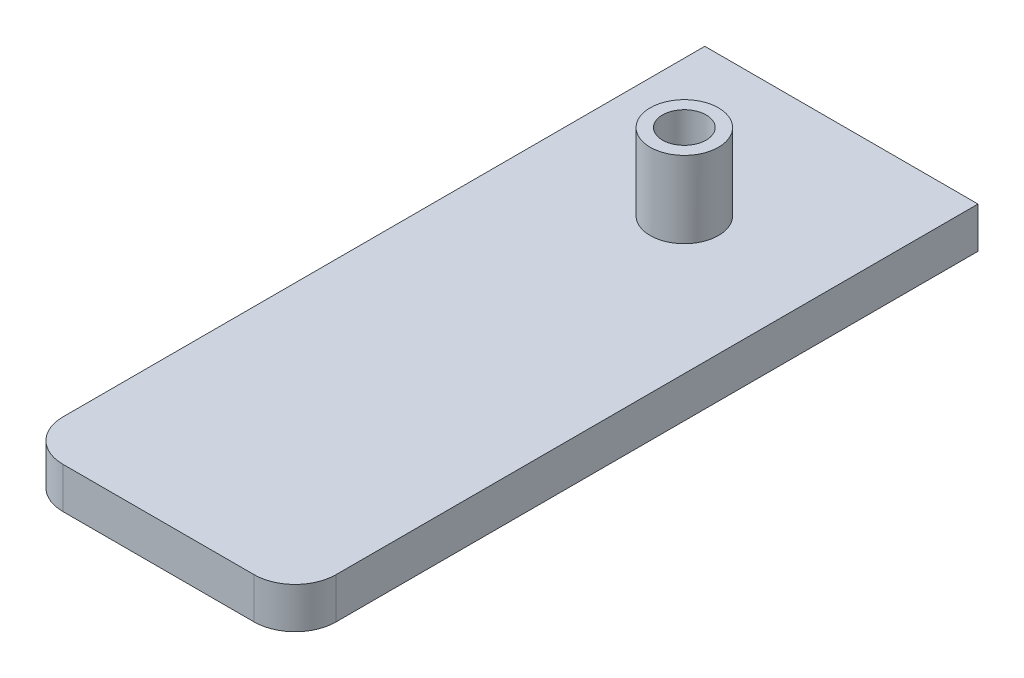
ISO-10303-21;
HEADER;
FILE_DESCRIPTION(('STEP AP214'),'2;1');
FILE_NAME('part.step','',(''),(''),'','','');
FILE_SCHEMA(('AUTOMOTIVE_DESIGN { 1 0 10303 214 1 1 1 1 }'));
ENDSEC;
DATA;
#1=APPLICATION_CONTEXT('core data for automotive mechanical design processes');
#2=APPLICATION_PROTOCOL_DEFINITION('international standard','automotive_design',2000,#1);
#3=PRODUCT_CONTEXT('',#1,'mechanical');
#4=PRODUCT('Part','Part','',(#3));
#5=PRODUCT_RELATED_PRODUCT_CATEGORY('part','',(#4));
#6=PRODUCT_DEFINITION_FORMATION('','',#4);
#7=PRODUCT_DEFINITION_CONTEXT('part definition',#1,'design');
#8=PRODUCT_DEFINITION('design','',#6,#7);
#9=PRODUCT_DEFINITION_SHAPE('','',#8);
#10=(LENGTH_UNIT() NAMED_UNIT(*) SI_UNIT(.MILLI.,.METRE.));
#11=(NAMED_UNIT(*) PLANE_ANGLE_UNIT() SI_UNIT($,.RADIAN.));
#12=(NAMED_UNIT(*) SI_UNIT($,.STERADIAN.) SOLID_ANGLE_UNIT());
#13=UNCERTAINTY_MEASURE_WITH_UNIT(LENGTH_MEASURE(1.E-05),#10,'distance_accuracy_value','');
#14=(GEOMETRIC_REPRESENTATION_CONTEXT(3) GLOBAL_UNCERTAINTY_ASSIGNED_CONTEXT((#13)) GLOBAL_UNIT_ASSIGNED_CONTEXT((#10,
#11,#12)) REPRESENTATION_CONTEXT('',''));
#15=CARTESIAN_POINT('',(0.,0.,0.));
#16=DIRECTION('',(0.,0.,1.));
#17=DIRECTION('',(1.,0.,0.));
#18=AXIS2_PLACEMENT_3D('',#15,#16,#17);
#19=CARTESIAN_POINT('',(0.,3.,0.));
#20=DIRECTION('',(0.,-1.,0.));
#21=DIRECTION('',(0.,0.,-1.));
#22=AXIS2_PLACEMENT_3D('',#19,#20,#21);
#23=PLANE('',#22);
#24=DIRECTION('',(0.,0.,1.));
#25=VECTOR('',#24,1.);
#26=CARTESIAN_POINT('',(-9.99999999999999,3.,25.));
#27=LINE('',#26,#25);
#28=CARTESIAN_POINT('',(-9.99999999999999,3.,-25.));
#29=VERTEX_POINT('',#28);
#30=CARTESIAN_POINT('',(-9.99999999999999,3.,22.));
#31=VERTEX_POINT('',#30);
#32=EDGE_CURVE('E117',#29,#31,#27,.T.);
#33=ORIENTED_EDGE('',*,*,#32,.T.);
#34=CARTESIAN_POINT('',(-6.99999999999999,3.,22.));
#35=DIRECTION('',(0.,-1.,0.));
#36=DIRECTION('',(0.,0.,-1.));
#37=AXIS2_PLACEMENT_3D('',#34,#35,#36);
#38=CIRCLE('',#37,3.);
#39=CARTESIAN_POINT('',(-7.,3.,25.));
#40=VERTEX_POINT('',#39);
#41=EDGE_CURVE('E54',#31,#40,#38,.F.);
#42=ORIENTED_EDGE('',*,*,#41,.T.);
#43=DIRECTION('',(1.,0.,0.));
#44=VECTOR('',#43,1.);
#45=CARTESIAN_POINT('',(-9.99999999999999,3.,25.));
#46=LINE('',#45,#44);
#47=CARTESIAN_POINT('',(7.00000000000001,3.,25.));
#48=VERTEX_POINT('',#47);
#49=EDGE_CURVE('E131',#40,#48,#46,.T.);
#50=ORIENTED_EDGE('',*,*,#49,.T.);
#51=CARTESIAN_POINT('',(7.00000000000001,3.,22.));
#52=DIRECTION('',(0.,-1.,0.));
#53=DIRECTION('',(0.,0.,-1.));
#54=AXIS2_PLACEMENT_3D('',#51,#52,#53);
#55=CIRCLE('',#54,3.);
#56=CARTESIAN_POINT('',(10.,3.,22.));
#57=VERTEX_POINT('',#56);
#58=EDGE_CURVE('E61',#48,#57,#55,.F.);
#59=ORIENTED_EDGE('',*,*,#58,.T.);
#60=DIRECTION('',(0.,0.,-1.));
#61=VECTOR('',#60,1.);
#62=CARTESIAN_POINT('',(10.,3.,25.));
#63=LINE('',#62,#61);
#64=CARTESIAN_POINT('',(10.,3.,-25.));
#65=VERTEX_POINT('',#64);
#66=EDGE_CURVE('E99',#57,#65,#63,.T.);
#67=ORIENTED_EDGE('',*,*,#66,.T.);
#68=DIRECTION('',(-1.,0.,0.));
#69=VECTOR('',#68,1.);
#70=CARTESIAN_POINT('',(-9.99999999999999,3.,-25.));
#71=LINE('',#70,#69);
#72=EDGE_CURVE('E102',#65,#29,#71,.T.);
#73=ORIENTED_EDGE('',*,*,#72,.T.);
#74=EDGE_LOOP('',(#33,#42,#50,#59,#67,#73));
#75=FACE_BOUND('',#74,.T.);
#76=CARTESIAN_POINT('',(6.04960526118248E-10,3.,-13.4999999995098));
#77=DIRECTION('',(0.,-1.,0.));
#78=DIRECTION('',(0.,0.,-1.));
#79=AXIS2_PLACEMENT_3D('',#76,#77,#78);
#80=CIRCLE('',#79,2.49999999950536);
#81=CARTESIAN_POINT('',(6.04960526118248E-10,3.,-15.9999999990152));
#82=VERTEX_POINT('',#81);
#83=EDGE_CURVE('E124',#82,#82,#80,.F.);
#84=ORIENTED_EDGE('',*,*,#83,.F.);
#85=EDGE_LOOP('',(#84));
#86=FACE_BOUND('',#85,.T.);
#87=ADVANCED_FACE('F45',(#75,#86),#23,.F.);
#88=CARTESIAN_POINT('',(10.,3.,25.));
#89=DIRECTION('',(-1.,0.,0.));
#90=DIRECTION('',(0.,0.,1.));
#91=AXIS2_PLACEMENT_3D('',#88,#89,#90);
#92=PLANE('',#91);
#93=ORIENTED_EDGE('',*,*,#66,.F.);
#94=DIRECTION('',(0.,-1.,0.));
#95=VECTOR('',#94,1.);
#96=CARTESIAN_POINT('',(10.,3.,22.));
#97=LINE('',#96,#95);
#98=CARTESIAN_POINT('',(10.,0.,22.));
#99=VERTEX_POINT('',#98);
#100=EDGE_CURVE('E11',#57,#99,#97,.T.);
#101=ORIENTED_EDGE('',*,*,#100,.T.);
#102=DIRECTION('',(0.,0.,-1.));
#103=VECTOR('',#102,1.);
#104=CARTESIAN_POINT('',(10.,0.,25.));
#105=LINE('',#104,#103);
#106=CARTESIAN_POINT('',(10.,0.,-25.));
#107=VERTEX_POINT('',#106);
#108=EDGE_CURVE('E121',#99,#107,#105,.T.);
#109=ORIENTED_EDGE('',*,*,#108,.T.);
#110=DIRECTION('',(0.,-1.,0.));
#111=VECTOR('',#110,1.);
#112=CARTESIAN_POINT('',(10.,3.,-25.));
#113=LINE('',#112,#111);
#114=EDGE_CURVE('E113',#65,#107,#113,.T.);
#115=ORIENTED_EDGE('',*,*,#114,.F.);
#116=EDGE_LOOP('',(#93,#101,#109,#115));
#117=FACE_BOUND('',#116,.T.);
#118=ADVANCED_FACE('F119',(#117),#92,.F.);
#119=CARTESIAN_POINT('',(-9.99999999999999,3.,-25.));
#120=DIRECTION('',(0.,0.,1.));
#121=DIRECTION('',(1.,0.,0.));
#122=AXIS2_PLACEMENT_3D('',#119,#120,#121);
#123=PLANE('',#122);
#124=DIRECTION('',(-1.,0.,0.));
#125=VECTOR('',#124,1.);
#126=CARTESIAN_POINT('',(-9.99999999999999,0.,-25.));
#127=LINE('',#126,#125);
#128=CARTESIAN_POINT('',(-9.99999999999999,0.,-25.));
#129=VERTEX_POINT('',#128);
#130=EDGE_CURVE('E169',#107,#129,#127,.T.);
#131=ORIENTED_EDGE('',*,*,#130,.T.);
#132=DIRECTION('',(0.,-1.,0.));
#133=VECTOR('',#132,1.);
#134=CARTESIAN_POINT('',(-9.99999999999999,3.,-25.));
#135=LINE('',#134,#133);
#136=EDGE_CURVE('E115',#29,#129,#135,.T.);
#137=ORIENTED_EDGE('',*,*,#136,.F.);
#138=ORIENTED_EDGE('',*,*,#72,.F.);
#139=ORIENTED_EDGE('',*,*,#114,.T.);
#140=EDGE_LOOP('',(#131,#137,#138,#139));
#141=FACE_BOUND('',#140,.T.);
#142=ADVANCED_FACE('F112',(#141),#123,.F.);
#143=CARTESIAN_POINT('',(-9.99999999999999,3.,25.));
#144=DIRECTION('',(1.,0.,0.));
#145=DIRECTION('',(0.,0.,-1.));
#146=AXIS2_PLACEMENT_3D('',#143,#144,#145);
#147=PLANE('',#146);
#148=DIRECTION('',(0.,0.,1.));
#149=VECTOR('',#148,1.);
#150=CARTESIAN_POINT('',(-9.99999999999999,0.,25.));
#151=LINE('',#150,#149);
#152=CARTESIAN_POINT('',(-9.99999999999999,0.,22.));
#153=VERTEX_POINT('',#152);
#154=EDGE_CURVE('E166',#129,#153,#151,.T.);
#155=ORIENTED_EDGE('',*,*,#154,.T.);
#156=DIRECTION('',(0.,-1.,0.));
#157=VECTOR('',#156,1.);
#158=CARTESIAN_POINT('',(-9.99999999999999,3.,22.));
#159=LINE('',#158,#157);
#160=EDGE_CURVE('E69',#153,#31,#159,.F.);
#161=ORIENTED_EDGE('',*,*,#160,.T.);
#162=ORIENTED_EDGE('',*,*,#32,.F.);
#163=ORIENTED_EDGE('',*,*,#136,.T.);
#164=EDGE_LOOP('',(#155,#161,#162,#163));
#165=FACE_BOUND('',#164,.T.);
#166=ADVANCED_FACE('F167',(#165),#147,.F.);
#167=CARTESIAN_POINT('',(-9.99999999999999,3.,25.));
#168=DIRECTION('',(0.,0.,-1.));
#169=DIRECTION('',(-1.,0.,0.));
#170=AXIS2_PLACEMENT_3D('',#167,#168,#169);
#171=PLANE('',#170);
#172=ORIENTED_EDGE('',*,*,#49,.F.);
#173=DIRECTION('',(0.,-1.,0.));
#174=VECTOR('',#173,1.);
#175=CARTESIAN_POINT('',(-7.,3.,25.));
#176=LINE('',#175,#174);
#177=CARTESIAN_POINT('',(-7.,0.,25.));
#178=VERTEX_POINT('',#177);
#179=EDGE_CURVE('E137',#40,#178,#176,.T.);
#180=ORIENTED_EDGE('',*,*,#179,.T.);
#181=DIRECTION('',(1.,0.,0.));
#182=VECTOR('',#181,1.);
#183=CARTESIAN_POINT('',(-9.99999999999999,0.,25.));
#184=LINE('',#183,#182);
#185=CARTESIAN_POINT('',(7.00000000000001,0.,25.));
#186=VERTEX_POINT('',#185);
#187=EDGE_CURVE('E108',#178,#186,#184,.T.);
#188=ORIENTED_EDGE('',*,*,#187,.T.);
#189=DIRECTION('',(0.,-1.,0.));
#190=VECTOR('',#189,1.);
#191=CARTESIAN_POINT('',(7.00000000000001,3.,25.));
#192=LINE('',#191,#190);
#193=EDGE_CURVE('E129',#186,#48,#192,.F.);
#194=ORIENTED_EDGE('',*,*,#193,.T.);
#195=EDGE_LOOP('',(#172,#180,#188,#194));
#196=FACE_BOUND('',#195,.T.);
#197=ADVANCED_FACE('F156',(#196),#171,.F.);
#198=CARTESIAN_POINT('',(0.,0.,0.));
#199=DIRECTION('',(0.,-1.,0.));
#200=DIRECTION('',(0.,0.,-1.));
#201=AXIS2_PLACEMENT_3D('',#198,#199,#200);
#202=PLANE('',#201);
#203=CARTESIAN_POINT('',(0.,0.,-13.5));
#204=DIRECTION('',(0.,-1.,0.));
#205=DIRECTION('',(0.,0.,-1.));
#206=AXIS2_PLACEMENT_3D('',#203,#204,#205);
#207=CIRCLE('',#206,1.6);
#208=CARTESIAN_POINT('',(0.,0.,-15.1));
#209=VERTEX_POINT('',#208);
#210=EDGE_CURVE('E176',#209,#209,#207,.T.);
#211=ORIENTED_EDGE('',*,*,#210,.F.);
#212=EDGE_LOOP('',(#211));
#213=FACE_BOUND('',#212,.T.);
#214=ORIENTED_EDGE('',*,*,#187,.F.);
#215=CARTESIAN_POINT('',(-6.99999999999999,0.,22.));
#216=DIRECTION('',(0.,-1.,0.));
#217=DIRECTION('',(0.,0.,-1.));
#218=AXIS2_PLACEMENT_3D('',#215,#216,#217);
#219=CIRCLE('',#218,3.);
#220=EDGE_CURVE('E144',#178,#153,#219,.T.);
#221=ORIENTED_EDGE('',*,*,#220,.T.);
#222=ORIENTED_EDGE('',*,*,#154,.F.);
#223=ORIENTED_EDGE('',*,*,#130,.F.);
#224=ORIENTED_EDGE('',*,*,#108,.F.);
#225=CARTESIAN_POINT('',(7.00000000000001,0.,22.));
#226=DIRECTION('',(0.,-1.,0.));
#227=DIRECTION('',(0.,0.,-1.));
#228=AXIS2_PLACEMENT_3D('',#225,#226,#227);
#229=CIRCLE('',#228,3.);
#230=EDGE_CURVE('E141',#99,#186,#229,.T.);
#231=ORIENTED_EDGE('',*,*,#230,.T.);
#232=EDGE_LOOP('',(#214,#221,#222,#223,#224,#231));
#233=FACE_BOUND('',#232,.T.);
#234=ADVANCED_FACE('F165',(#213,#233),#202,.T.);
#235=CARTESIAN_POINT('',(0.,10.,-13.5));
#236=DIRECTION('',(0.,-1.,0.));
#237=DIRECTION('',(0.,0.,-1.));
#238=AXIS2_PLACEMENT_3D('',#235,#236,#237);
#239=CYLINDRICAL_SURFACE('',#238,1.6);
#240=ORIENTED_EDGE('',*,*,#210,.T.);
#241=EDGE_LOOP('',(#240));
#242=FACE_BOUND('',#241,.T.);
#243=CARTESIAN_POINT('',(6.04960526118248E-10,8.6,-13.4999999995098));
#244=DIRECTION('',(0.,1.,0.));
#245=DIRECTION('',(0.,0.,1.));
#246=AXIS2_PLACEMENT_3D('',#243,#244,#245);
#247=CIRCLE('',#246,1.59999999947568);
#248=CARTESIAN_POINT('',(6.04960526118248E-10,8.6,-11.9000000000341));
#249=VERTEX_POINT('',#248);
#250=EDGE_CURVE('E187',#249,#249,#247,.T.);
#251=ORIENTED_EDGE('',*,*,#250,.T.);
#252=EDGE_LOOP('',(#251));
#253=FACE_BOUND('',#252,.T.);
#254=ADVANCED_FACE('F192',(#242,#253),#239,.F.);
#255=CARTESIAN_POINT('',(6.04960526118248E-10,8.6,-13.4999999995098));
#256=DIRECTION('',(0.,1.,0.));
#257=DIRECTION('',(0.,0.,1.));
#258=AXIS2_PLACEMENT_3D('',#255,#256,#257);
#259=PLANE('',#258);
#260=CARTESIAN_POINT('',(6.04960526118248E-10,8.6,-13.4999999995098));
#261=DIRECTION('',(0.,1.,0.));
#262=DIRECTION('',(0.,0.,1.));
#263=AXIS2_PLACEMENT_3D('',#260,#261,#262);
#264=CIRCLE('',#263,2.49999999950536);
#265=CARTESIAN_POINT('',(6.04960526118248E-10,8.6,-11.0000000000044));
#266=VERTEX_POINT('',#265);
#267=EDGE_CURVE('E183',#266,#266,#264,.T.);
#268=ORIENTED_EDGE('',*,*,#267,.T.);
#269=EDGE_LOOP('',(#268));
#270=FACE_BOUND('',#269,.T.);
#271=ORIENTED_EDGE('',*,*,#250,.F.);
#272=EDGE_LOOP('',(#271));
#273=FACE_BOUND('',#272,.T.);
#274=ADVANCED_FACE('F194',(#270,#273),#259,.T.);
#275=CARTESIAN_POINT('',(6.04960526118248E-10,8.6,-13.4999999995098));
#276=DIRECTION('',(0.,-1.,0.));
#277=DIRECTION('',(0.,0.,-1.));
#278=AXIS2_PLACEMENT_3D('',#275,#276,#277);
#279=CYLINDRICAL_SURFACE('',#278,2.49999999950536);
#280=ORIENTED_EDGE('',*,*,#267,.F.);
#281=EDGE_LOOP('',(#280));
#282=FACE_BOUND('',#281,.T.);
#283=ORIENTED_EDGE('',*,*,#83,.T.);
#284=EDGE_LOOP('',(#283));
#285=FACE_BOUND('',#284,.T.);
#286=ADVANCED_FACE('F196',(#282,#285),#279,.T.);
#287=CARTESIAN_POINT('',(-6.99999999999999,3.,22.));
#288=DIRECTION('',(0.,-1.,0.));
#289=DIRECTION('',(0.,0.,-1.));
#290=AXIS2_PLACEMENT_3D('',#287,#288,#289);
#291=CYLINDRICAL_SURFACE('',#290,3.);
#292=ORIENTED_EDGE('',*,*,#41,.F.);
#293=ORIENTED_EDGE('',*,*,#160,.F.);
#294=ORIENTED_EDGE('',*,*,#220,.F.);
#295=ORIENTED_EDGE('',*,*,#179,.F.);
#296=EDGE_LOOP('',(#292,#293,#294,#295));
#297=FACE_BOUND('',#296,.T.);
#298=ADVANCED_FACE('F162',(#297),#291,.T.);
#299=CARTESIAN_POINT('',(7.00000000000001,3.,22.));
#300=DIRECTION('',(0.,-1.,0.));
#301=DIRECTION('',(0.,0.,-1.));
#302=AXIS2_PLACEMENT_3D('',#299,#300,#301);
#303=CYLINDRICAL_SURFACE('',#302,3.);
#304=ORIENTED_EDGE('',*,*,#58,.F.);
#305=ORIENTED_EDGE('',*,*,#193,.F.);
#306=ORIENTED_EDGE('',*,*,#230,.F.);
#307=ORIENTED_EDGE('',*,*,#100,.F.);
#308=EDGE_LOOP('',(#304,#305,#306,#307));
#309=FACE_BOUND('',#308,.T.);
#310=ADVANCED_FACE('F47',(#309),#303,.T.);
#311=CLOSED_SHELL('',(#87,#118,#142,#166,#197,#234,#254,#274,#286,#298,#310));
#312=MANIFOLD_SOLID_BREP('B2',#311);
#313=ADVANCED_BREP_SHAPE_REPRESENTATION('',(#18,#312),#14);
#314=SHAPE_DEFINITION_REPRESENTATION(#9,#313);
ENDSEC;
END-ISO-10303-21;
